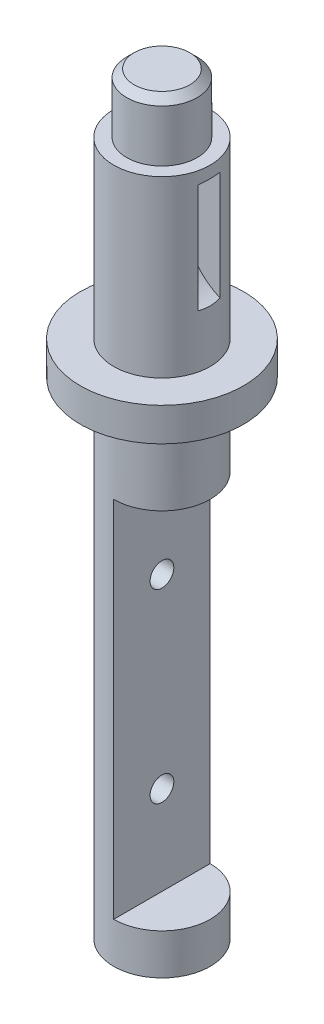
ISO-10303-21;
HEADER;
FILE_DESCRIPTION(('STEP AP214'),'2;1');
FILE_NAME('part.step','',(''),(''),'','','');
FILE_SCHEMA(('AUTOMOTIVE_DESIGN { 1 0 10303 214 1 1 1 1 }'));
ENDSEC;
DATA;
#1=APPLICATION_CONTEXT('core data for automotive mechanical design processes');
#2=APPLICATION_PROTOCOL_DEFINITION('international standard','automotive_design',2000,#1);
#3=PRODUCT_CONTEXT('',#1,'mechanical');
#4=PRODUCT('Part','Part','',(#3));
#5=PRODUCT_RELATED_PRODUCT_CATEGORY('part','',(#4));
#6=PRODUCT_DEFINITION_FORMATION('','',#4);
#7=PRODUCT_DEFINITION_CONTEXT('part definition',#1,'design');
#8=PRODUCT_DEFINITION('design','',#6,#7);
#9=PRODUCT_DEFINITION_SHAPE('','',#8);
#10=(LENGTH_UNIT() NAMED_UNIT(*) SI_UNIT(.MILLI.,.METRE.));
#11=(NAMED_UNIT(*) PLANE_ANGLE_UNIT() SI_UNIT($,.RADIAN.));
#12=(NAMED_UNIT(*) SI_UNIT($,.STERADIAN.) SOLID_ANGLE_UNIT());
#13=UNCERTAINTY_MEASURE_WITH_UNIT(LENGTH_MEASURE(1.E-05),#10,'distance_accuracy_value','');
#14=(GEOMETRIC_REPRESENTATION_CONTEXT(3) GLOBAL_UNCERTAINTY_ASSIGNED_CONTEXT((#13)) GLOBAL_UNIT_ASSIGNED_CONTEXT((#10,
#11,#12)) REPRESENTATION_CONTEXT('',''));
#15=CARTESIAN_POINT('',(0.,0.,0.));
#16=DIRECTION('',(0.,0.,1.));
#17=DIRECTION('',(1.,0.,0.));
#18=AXIS2_PLACEMENT_3D('',#15,#16,#17);
#19=CARTESIAN_POINT('',(0.,101.5,0.));
#20=DIRECTION('',(0.,1.,0.));
#21=DIRECTION('',(-1.,0.,0.));
#22=AXIS2_PLACEMENT_3D('',#19,#20,#21);
#23=CYLINDRICAL_SURFACE('',#22,6.5);
#24=CARTESIAN_POINT('',(0.,70.,0.));
#25=DIRECTION('',(0.,1.,0.));
#26=DIRECTION('',(-1.,0.,0.));
#27=AXIS2_PLACEMENT_3D('',#24,#25,#26);
#28=CIRCLE('',#27,6.5);
#29=CARTESIAN_POINT('',(-6.5,70.,0.));
#30=VERTEX_POINT('',#29);
#31=EDGE_CURVE('E164',#30,#30,#28,.T.);
#32=ORIENTED_EDGE('',*,*,#31,.T.);
#33=EDGE_LOOP('',(#32));
#34=FACE_BOUND('',#33,.T.);
#35=CARTESIAN_POINT('',(0.,93.5,0.));
#36=DIRECTION('',(0.,1.,0.));
#37=DIRECTION('',(-1.,0.,0.));
#38=AXIS2_PLACEMENT_3D('',#35,#36,#37);
#39=CIRCLE('',#38,6.5);
#40=CARTESIAN_POINT('',(-6.5,93.5,0.));
#41=VERTEX_POINT('',#40);
#42=EDGE_CURVE('E167',#41,#41,#39,.T.);
#43=ORIENTED_EDGE('',*,*,#42,.F.);
#44=EDGE_LOOP('',(#43));
#45=FACE_BOUND('',#44,.T.);
#46=DIRECTION('',(0.,1.,0.));
#47=VECTOR('',#46,1.);
#48=CARTESIAN_POINT('',(6.32455532033676,101.5,-1.5));
#49=LINE('',#48,#47);
#50=CARTESIAN_POINT('',(6.32455532033676,77.1572109463503,-1.5));
#51=VERTEX_POINT('',#50);
#52=CARTESIAN_POINT('',(6.32455532033676,91.8427890536497,-1.5));
#53=VERTEX_POINT('',#52);
#54=EDGE_CURVE('E11',#51,#53,#49,.T.);
#55=ORIENTED_EDGE('',*,*,#54,.F.);
#56=CARTESIAN_POINT('',(6.32455532033676,77.1572109463503,-1.5));
#57=CARTESIAN_POINT('',(6.36369188460603,77.1403303029999,-1.33510222582263));
#58=CARTESIAN_POINT('',(6.39639587269136,77.1265157354398,-1.16837509462122));
#59=CARTESIAN_POINT('',(6.44870789663685,77.1046910664355,-0.832452010255987));
#60=CARTESIAN_POINT('',(6.46831209671936,77.0966826650493,-0.663255348789912));
#61=CARTESIAN_POINT('',(6.49390271903072,77.0862612176093,-0.327198306937037));
#62=CARTESIAN_POINT('',(6.50016282821957,77.083735697357,-0.160362137256159));
#63=CARTESIAN_POINT('',(6.49983080920877,77.0838699020486,0.173224201777556));
#64=CARTESIAN_POINT('',(6.4932442174338,77.0865273933176,0.339974377212649));
#65=CARTESIAN_POINT('',(6.46723909581566,77.0971222306045,0.672879243442487));
#66=CARTESIAN_POINT('',(6.44777673660587,77.105077611357,0.839029944427268));
#67=CARTESIAN_POINT('',(6.39593146158079,77.1267109913205,1.17073737982097));
#68=CARTESIAN_POINT('',(6.36341374617465,77.1404487690674,1.33626914011728));
#69=CARTESIAN_POINT('',(6.32455532033676,77.1572109463503,1.5));
#70=B_SPLINE_CURVE_WITH_KNOTS('',3,(#56,#57,#58,#59,#60,#61,#62,#63,#64,#65,#66,#67,#68,#69),
.UNSPECIFIED.,.F.,.F.,(4,2,2,2,2,2,4),(0.,0.510779497228711,1.02170849145992,1.52205330932766,
2.02218254583026,2.5240230526441,3.03118421156089),.UNSPECIFIED.);
#71=CARTESIAN_POINT('',(6.32455532033676,77.1572109463503,1.5));
#72=VERTEX_POINT('',#71);
#73=EDGE_CURVE('E51',#51,#72,#70,.T.);
#74=ORIENTED_EDGE('',*,*,#73,.T.);
#75=DIRECTION('',(0.,1.,0.));
#76=VECTOR('',#75,1.);
#77=CARTESIAN_POINT('',(6.32455532033676,101.5,1.5));
#78=LINE('',#77,#76);
#79=CARTESIAN_POINT('',(6.32455532033676,91.8427890536497,1.5));
#80=VERTEX_POINT('',#79);
#81=EDGE_CURVE('E82',#72,#80,#78,.T.);
#82=ORIENTED_EDGE('',*,*,#81,.T.);
#83=CARTESIAN_POINT('',(6.32455532033676,91.8427890536497,1.5));
#84=CARTESIAN_POINT('',(6.36369188460603,91.8596696970001,1.33510222582263));
#85=CARTESIAN_POINT('',(6.39639587269136,91.8734842645602,1.16837509462122));
#86=CARTESIAN_POINT('',(6.44870789663685,91.8953089335645,0.832452010255986));
#87=CARTESIAN_POINT('',(6.46831209671936,91.9033173349507,0.663255348789912));
#88=CARTESIAN_POINT('',(6.49390271903072,91.9137387823907,0.327198306937037));
#89=CARTESIAN_POINT('',(6.50016282821957,91.916264302643,0.160362137256159));
#90=CARTESIAN_POINT('',(6.49983080920877,91.9161300979514,-0.173224201777556));
#91=CARTESIAN_POINT('',(6.4932442174338,91.9134726066824,-0.339974377212648));
#92=CARTESIAN_POINT('',(6.46723909581566,91.9028777693955,-0.672879243442486));
#93=CARTESIAN_POINT('',(6.44777673660587,91.894922388643,-0.839029944427268));
#94=CARTESIAN_POINT('',(6.39593146158079,91.8732890086795,-1.17073737982097));
#95=CARTESIAN_POINT('',(6.36341374617465,91.8595512309326,-1.33626914011728));
#96=CARTESIAN_POINT('',(6.32455532033676,91.8427890536497,-1.5));
#97=B_SPLINE_CURVE_WITH_KNOTS('',3,(#83,#84,#85,#86,#87,#88,#89,#90,#91,#92,#93,#94,#95,#96),
.UNSPECIFIED.,.F.,.F.,(4,2,2,2,2,2,4),(0.,0.510779497228712,1.02170849145992,1.52205330932765,
2.02218254583026,2.5240230526441,3.03118421156089),.UNSPECIFIED.);
#98=EDGE_CURVE('E88',#80,#53,#97,.T.);
#99=ORIENTED_EDGE('',*,*,#98,.T.);
#100=EDGE_LOOP('',(#55,#74,#82,#99));
#101=FACE_BOUND('',#100,.T.);
#102=ADVANCED_FACE('F41',(#34,#45,#101),#23,.T.);
#103=CARTESIAN_POINT('',(0.,0.,0.));
#104=DIRECTION('',(0.,1.,0.));
#105=DIRECTION('',(-1.,0.,0.));
#106=AXIS2_PLACEMENT_3D('',#103,#104,#105);
#107=PLANE('',#106);
#108=CARTESIAN_POINT('',(0.,0.,0.));
#109=DIRECTION('',(0.,1.,0.));
#110=DIRECTION('',(-1.,0.,0.));
#111=AXIS2_PLACEMENT_3D('',#108,#109,#110);
#112=CIRCLE('',#111,6.5);
#113=CARTESIAN_POINT('',(-6.5,0.,0.));
#114=VERTEX_POINT('',#113);
#115=EDGE_CURVE('E191',#114,#114,#112,.T.);
#116=ORIENTED_EDGE('',*,*,#115,.F.);
#117=EDGE_LOOP('',(#116));
#118=FACE_BOUND('',#117,.T.);
#119=ADVANCED_FACE('F154',(#118),#107,.F.);
#120=CARTESIAN_POINT('',(0.,101.5,0.));
#121=DIRECTION('',(0.,1.,0.));
#122=DIRECTION('',(-1.,0.,0.));
#123=AXIS2_PLACEMENT_3D('',#120,#121,#122);
#124=CYLINDRICAL_SURFACE('',#123,6.5);
#125=CARTESIAN_POINT('',(-6.5,40.9,0.));
#126=CARTESIAN_POINT('',(-6.49999847679289,40.9000025600073,-0.0884450959741308));
#127=CARTESIAN_POINT('',(-6.49817676699475,40.907358311482,-0.176919069140547));
#128=CARTESIAN_POINT('',(-6.49108604637441,40.9365446642992,-0.351334263124421));
#129=CARTESIAN_POINT('',(-6.48581501588464,40.9583837461114,-0.437273969233678));
#130=CARTESIAN_POINT('',(-6.47240975585621,41.0157958286159,-0.604076483461091));
#131=CARTESIAN_POINT('',(-6.46427890852362,41.0513526106517,-0.684945156371071));
#132=CARTESIAN_POINT('',(-6.4460214474454,41.1351344107593,-0.839569428496132));
#133=CARTESIAN_POINT('',(-6.43589478136753,41.1833597610239,-0.913324841119285));
#134=CARTESIAN_POINT('',(-6.41451977935108,41.292129387444,-1.05310528239877));
#135=CARTESIAN_POINT('',(-6.4032545638188,41.352879368107,-1.11896767068979));
#136=CARTESIAN_POINT('',(-6.38098512142482,41.4845332172551,-1.23967933009471));
#137=CARTESIAN_POINT('',(-6.3699809232828,41.5554381971066,-1.29452739421706));
#138=CARTESIAN_POINT('',(-6.34930979320854,41.7066443241118,-1.3924122072462));
#139=CARTESIAN_POINT('',(-6.33966431781124,41.7870657086879,-1.43526816323326));
#140=CARTESIAN_POINT('',(-6.32304842116449,41.9542469193137,-1.50678997701349));
#141=CARTESIAN_POINT('',(-6.31607758659514,42.0410057635491,-1.5354580275028));
#142=CARTESIAN_POINT('',(-6.30577353146237,42.2166137380089,-1.57723764537635));
#143=CARTESIAN_POINT('',(-6.30237216358611,42.3053893378179,-1.59064108188605));
#144=CARTESIAN_POINT('',(-6.29938808755674,42.4839892271366,-1.60241992785259));
#145=CARTESIAN_POINT('',(-6.29980477827164,42.5738133493383,-1.60079770301542));
#146=CARTESIAN_POINT('',(-6.30434842318276,42.7497324726038,-1.58280440383047));
#147=CARTESIAN_POINT('',(-6.30838817205864,42.8358655308682,-1.56677996482469));
#148=CARTESIAN_POINT('',(-6.31958392378279,43.0041816336552,-1.52098957994436));
#149=CARTESIAN_POINT('',(-6.32674014258101,43.0863644040117,-1.49122268180325));
#150=CARTESIAN_POINT('',(-6.34344330774301,43.2453823552798,-1.41849402659643));
#151=CARTESIAN_POINT('',(-6.35301305186749,43.3221570640332,-1.37540550538329));
#152=CARTESIAN_POINT('',(-6.37345198810655,43.4675111773534,-1.27734544159618));
#153=CARTESIAN_POINT('',(-6.38432140105722,43.53608918519,-1.22237187826304));
#154=CARTESIAN_POINT('',(-6.40650306081737,43.6650909076582,-1.10030157431611));
#155=CARTESIAN_POINT('',(-6.4178192482921,43.725237197386,-1.0329120144452));
#156=CARTESIAN_POINT('',(-6.43934844063598,43.8334267078951,-0.888868155037166));
#157=CARTESIAN_POINT('',(-6.44956141379675,43.8814695808553,-0.812213589341127));
#158=CARTESIAN_POINT('',(-6.46778178886516,43.9641859630261,-0.651427281318158));
#159=CARTESIAN_POINT('',(-6.475781919824,43.9988155446562,-0.567272063289674));
#160=CARTESIAN_POINT('',(-6.48862222528603,44.0533598817869,-0.394094239193905));
#161=CARTESIAN_POINT('',(-6.4934629852469,44.0732773636519,-0.305072538241802));
#162=CARTESIAN_POINT('',(-6.49935291484978,44.0974110610489,-0.127061671114192));
#163=CARTESIAN_POINT('',(-6.50049333179833,44.1020052180412,-0.038126688605644));
#164=CARTESIAN_POINT('',(-6.49911342661941,44.0963968632235,0.139241112863296));
#165=CARTESIAN_POINT('',(-6.49659342331214,44.0861956400816,0.227673974884574));
#166=CARTESIAN_POINT('',(-6.4882341917293,44.0515979133135,0.40022184155561));
#167=CARTESIAN_POINT('',(-6.48244296155053,44.0274065645594,0.484380517349514));
#168=CARTESIAN_POINT('',(-6.46819327022747,43.9657487614887,0.647441551075505));
#169=CARTESIAN_POINT('',(-6.45973454457628,43.9282809906462,0.72634338680296));
#170=CARTESIAN_POINT('',(-6.44086865877031,43.8403943888819,0.87816243308333));
#171=CARTESIAN_POINT('',(-6.43043029526398,43.7897625279667,0.950952352705239));
#172=CARTESIAN_POINT('',(-6.4088139161694,43.6772583307833,1.08713696901788));
#173=CARTESIAN_POINT('',(-6.39763577723942,43.6153841170762,1.15053009325664));
#174=CARTESIAN_POINT('',(-6.37547290612023,43.4803991357933,1.26767107080319));
#175=CARTESIAN_POINT('',(-6.3644990662902,43.407056472249,1.32115419992861));
#176=CARTESIAN_POINT('',(-6.34428432556465,43.252213034813,1.41505206113258));
#177=CARTESIAN_POINT('',(-6.33504334732852,43.1707126252649,1.45546737650864));
#178=CARTESIAN_POINT('',(-6.31944109818521,43.0023078147583,1.52178359815182));
#179=CARTESIAN_POINT('',(-6.31306281407692,42.9154389277139,1.54777047861512));
#180=CARTESIAN_POINT('',(-6.30388950053647,42.7383849624583,1.58472282899883));
#181=CARTESIAN_POINT('',(-6.30109371588561,42.6482005873027,1.59569146491517));
#182=CARTESIAN_POINT('',(-6.2994582563016,42.469766053111,1.60213437636161));
#183=CARTESIAN_POINT('',(-6.30051067071695,42.3815318951603,1.59803127643297));
#184=CARTESIAN_POINT('',(-6.30620423919642,42.207054938739,1.57541152386757));
#185=CARTESIAN_POINT('',(-6.31084532535473,42.1208121026199,1.55689514396265));
#186=CARTESIAN_POINT('',(-6.32313410038235,41.9532093638998,1.50620197689929));
#187=CARTESIAN_POINT('',(-6.33076482963178,41.8718248507785,1.47410216486609));
#188=CARTESIAN_POINT('',(-6.34817596823125,41.7155394032788,1.39721464976362));
#189=CARTESIAN_POINT('',(-6.35795666659036,41.6406393424599,1.35242524066421));
#190=CARTESIAN_POINT('',(-6.37887533010823,41.4974012527481,1.25009507865889));
#191=CARTESIAN_POINT('',(-6.39004140338445,41.4292775439332,1.19226002366241));
#192=CARTESIAN_POINT('',(-6.41230232297716,41.303564567394,1.06605685145264));
#193=CARTESIAN_POINT('',(-6.42339715183421,41.2459777934556,0.997686247816543));
#194=CARTESIAN_POINT('',(-6.44449584945342,41.141997840714,0.850916228091247));
#195=CARTESIAN_POINT('',(-6.45447736265697,41.0958169885822,0.772362939181988));
#196=CARTESIAN_POINT('',(-6.47199065299952,41.0173897495588,0.608370445134174));
#197=CARTESIAN_POINT('',(-6.47952422432342,40.9851331513573,0.522936340766141));
#198=CARTESIAN_POINT('',(-6.49014861566423,40.9403850199706,0.36468429109301));
#199=CARTESIAN_POINT('',(-6.49381784225452,40.9252728525866,0.292634834729842));
#200=CARTESIAN_POINT('',(-6.49874408258204,40.9050796322138,0.147063504485682));
#201=CARTESIAN_POINT('',(-6.50000126654047,40.8999978713644,0.0735417348779227));
#202=CARTESIAN_POINT('',(-6.5,40.9,0.));
#203=B_SPLINE_CURVE_WITH_KNOTS('',3,(#125,#126,#127,#128,#129,#130,#131,#132,#133,#134,#135,
#136,#137,#138,#139,#140,#141,#142,#143,#144,#145,#146,#147,#148,#149,#150,#151,#152,#153,#154,
#155,#156,#157,#158,#159,#160,#161,#162,#163,#164,#165,#166,#167,#168,#169,#170,#171,#172,#173,
#174,#175,#176,#177,#178,#179,#180,#181,#182,#183,#184,#185,#186,#187,#188,#189,#190,#191,#192,
#193,#194,#195,#196,#197,#198,#199,#200,#201,#202),.UNSPECIFIED.,.T.,.F.,(4,2,2,2,2,2,2,2,2,2,2,
2,2,2,2,2,2,2,2,2,2,2,2,2,2,2,2,2,2,2,2,2,2,2,2,2,2,2,4),(0.,0.265065826097963,
0.530286994213678,0.795195543358522,1.06011103957947,1.32978472451693,1.59948794521558,
1.87306152995696,2.14659282154836,2.41480126402156,2.68296747929984,2.944847317652,
3.20674530536507,3.47121640084301,3.73573249854129,4.00755204127506,4.27937939451653,
4.55208958456014,4.82474922478114,5.09063207777168,5.35649177392924,5.61854827597385,
5.88063077152499,6.14725157568416,6.41391694570262,6.68691332818938,6.95989752347348,
7.23123714500753,7.50251955662789,7.76625378635416,8.02998302575402,8.29223735599092,
8.55452696128593,8.82346155925037,9.09245972411299,9.36614096691334,9.63962116401274,
9.86003786792978,10.0804390161607),.UNSPECIFIED.);
#204=CARTESIAN_POINT('',(-6.5,40.9,0.));
#205=VERTEX_POINT('',#204);
#206=EDGE_CURVE('E97',#205,#205,#203,.T.);
#207=ORIENTED_EDGE('',*,*,#206,.T.);
#208=EDGE_LOOP('',(#207));
#209=FACE_BOUND('',#208,.T.);
#210=CARTESIAN_POINT('',(-6.5,15.9,0.));
#211=CARTESIAN_POINT('',(-6.49999847679289,15.9000025600073,-0.088445095974131));
#212=CARTESIAN_POINT('',(-6.49817676699475,15.907358311482,-0.176919069140547));
#213=CARTESIAN_POINT('',(-6.49108604637441,15.9365446642992,-0.351334263124422));
#214=CARTESIAN_POINT('',(-6.48581501588464,15.9583837461114,-0.437273969233679));
#215=CARTESIAN_POINT('',(-6.4724097558562,16.0157958286159,-0.604076483461092));
#216=CARTESIAN_POINT('',(-6.46427890852362,16.0513526106517,-0.684945156371072));
#217=CARTESIAN_POINT('',(-6.4460214474454,16.1351344107593,-0.839569428496132));
#218=CARTESIAN_POINT('',(-6.43589478136753,16.1833597610239,-0.913324841119284));
#219=CARTESIAN_POINT('',(-6.41451977935108,16.292129387444,-1.05310528239877));
#220=CARTESIAN_POINT('',(-6.4032545638188,16.352879368107,-1.1189676706898));
#221=CARTESIAN_POINT('',(-6.38098512142482,16.4845332172551,-1.23967933009471));
#222=CARTESIAN_POINT('',(-6.36998092328279,16.5554381971066,-1.29452739421707));
#223=CARTESIAN_POINT('',(-6.34930979320853,16.7066443241118,-1.3924122072462));
#224=CARTESIAN_POINT('',(-6.33966431781124,16.7870657086879,-1.43526816323327));
#225=CARTESIAN_POINT('',(-6.32304842116448,16.9542469193137,-1.5067899770135));
#226=CARTESIAN_POINT('',(-6.31607758659514,17.0410057635491,-1.53545802750281));
#227=CARTESIAN_POINT('',(-6.30577353146237,17.2166137380089,-1.57723764537635));
#228=CARTESIAN_POINT('',(-6.30237216358611,17.3053893378179,-1.59064108188605));
#229=CARTESIAN_POINT('',(-6.29938808755674,17.4839892271366,-1.60241992785259));
#230=CARTESIAN_POINT('',(-6.29980477827164,17.5738133493383,-1.60079770301542));
#231=CARTESIAN_POINT('',(-6.30434842318276,17.7497324726038,-1.58280440383047));
#232=CARTESIAN_POINT('',(-6.30838817205863,17.8358655308682,-1.56677996482469));
#233=CARTESIAN_POINT('',(-6.31958392378279,18.0041816336552,-1.52098957994436));
#234=CARTESIAN_POINT('',(-6.32674014258101,18.0863644040117,-1.49122268180326));
#235=CARTESIAN_POINT('',(-6.34344330774301,18.2453823552798,-1.41849402659644));
#236=CARTESIAN_POINT('',(-6.35301305186749,18.3221570640332,-1.37540550538329));
#237=CARTESIAN_POINT('',(-6.37345198810655,18.4675111773534,-1.27734544159618));
#238=CARTESIAN_POINT('',(-6.38432140105722,18.53608918519,-1.22237187826304));
#239=CARTESIAN_POINT('',(-6.40650306081737,18.6650909076582,-1.10030157431611));
#240=CARTESIAN_POINT('',(-6.4178192482921,18.725237197386,-1.0329120144452));
#241=CARTESIAN_POINT('',(-6.43934844063598,18.8334267078951,-0.888868155037164));
#242=CARTESIAN_POINT('',(-6.44956141379675,18.8814695808552,-0.812213589341126));
#243=CARTESIAN_POINT('',(-6.46778178886515,18.9641859630261,-0.651427281318159));
#244=CARTESIAN_POINT('',(-6.475781919824,18.9988155446562,-0.567272063289675));
#245=CARTESIAN_POINT('',(-6.48862222528603,19.0533598817869,-0.394094239193908));
#246=CARTESIAN_POINT('',(-6.4934629852469,19.0732773636519,-0.305072538241805));
#247=CARTESIAN_POINT('',(-6.49935291484978,19.0974110610489,-0.127061671114194));
#248=CARTESIAN_POINT('',(-6.50049333179833,19.1020052180412,-0.0381266886056464));
#249=CARTESIAN_POINT('',(-6.49911342661941,19.0963968632235,0.139241112863294));
#250=CARTESIAN_POINT('',(-6.49659342331214,19.0861956400816,0.227673974884573));
#251=CARTESIAN_POINT('',(-6.4882341917293,19.0515979133135,0.400221841555611));
#252=CARTESIAN_POINT('',(-6.48244296155053,19.0274065645594,0.484380517349516));
#253=CARTESIAN_POINT('',(-6.46819327022747,18.9657487614887,0.647441551075507));
#254=CARTESIAN_POINT('',(-6.45973454457628,18.9282809906462,0.726343386802961));
#255=CARTESIAN_POINT('',(-6.44086865877031,18.8403943888819,0.878162433083331));
#256=CARTESIAN_POINT('',(-6.43043029526397,18.7897625279667,0.950952352705241));
#257=CARTESIAN_POINT('',(-6.4088139161694,18.6772583307833,1.08713696901789));
#258=CARTESIAN_POINT('',(-6.39763577723942,18.6153841170762,1.15053009325664));
#259=CARTESIAN_POINT('',(-6.37547290612023,18.4803991357933,1.26767107080319));
#260=CARTESIAN_POINT('',(-6.36449906629019,18.407056472249,1.32115419992861));
#261=CARTESIAN_POINT('',(-6.34428432556464,18.252213034813,1.41505206113259));
#262=CARTESIAN_POINT('',(-6.33504334732852,18.1707126252649,1.45546737650864));
#263=CARTESIAN_POINT('',(-6.31944109818521,18.0023078147583,1.52178359815182));
#264=CARTESIAN_POINT('',(-6.31306281407692,17.9154389277139,1.54777047861512));
#265=CARTESIAN_POINT('',(-6.30388950053647,17.7383849624583,1.58472282899883));
#266=CARTESIAN_POINT('',(-6.30109371588561,17.6482005873027,1.59569146491517));
#267=CARTESIAN_POINT('',(-6.2994582563016,17.4697660531109,1.60213437636162));
#268=CARTESIAN_POINT('',(-6.30051067071695,17.3815318951603,1.59803127643297));
#269=CARTESIAN_POINT('',(-6.30620423919642,17.207054938739,1.57541152386757));
#270=CARTESIAN_POINT('',(-6.31084532535473,17.1208121026199,1.55689514396265));
#271=CARTESIAN_POINT('',(-6.32313410038234,16.9532093638998,1.50620197689929));
#272=CARTESIAN_POINT('',(-6.33076482963178,16.8718248507785,1.47410216486609));
#273=CARTESIAN_POINT('',(-6.34817596823125,16.7155394032788,1.39721464976361));
#274=CARTESIAN_POINT('',(-6.35795666659036,16.6406393424599,1.35242524066421));
#275=CARTESIAN_POINT('',(-6.37887533010823,16.4974012527481,1.25009507865889));
#276=CARTESIAN_POINT('',(-6.39004140338445,16.4292775439332,1.1922600236624));
#277=CARTESIAN_POINT('',(-6.41230232297716,16.303564567394,1.06605685145264));
#278=CARTESIAN_POINT('',(-6.42339715183421,16.2459777934556,0.997686247816544));
#279=CARTESIAN_POINT('',(-6.44449584945342,16.141997840714,0.850916228091249));
#280=CARTESIAN_POINT('',(-6.45447736265697,16.0958169885822,0.77236293918199));
#281=CARTESIAN_POINT('',(-6.47199065299951,16.0173897495588,0.608370445134174));
#282=CARTESIAN_POINT('',(-6.47952422432342,15.9851331513573,0.522936340766138));
#283=CARTESIAN_POINT('',(-6.49014861566423,15.9403850199706,0.364684291093005));
#284=CARTESIAN_POINT('',(-6.49381784225452,15.9252728525866,0.292634834729838));
#285=CARTESIAN_POINT('',(-6.49874408258204,15.9050796322138,0.147063504485679));
#286=CARTESIAN_POINT('',(-6.50000126654047,15.8999978713644,0.073541734877921));
#287=CARTESIAN_POINT('',(-6.5,15.9,0.));
#288=B_SPLINE_CURVE_WITH_KNOTS('',3,(#210,#211,#212,#213,#214,#215,#216,#217,#218,#219,#220,
#221,#222,#223,#224,#225,#226,#227,#228,#229,#230,#231,#232,#233,#234,#235,#236,#237,#238,#239,
#240,#241,#242,#243,#244,#245,#246,#247,#248,#249,#250,#251,#252,#253,#254,#255,#256,#257,#258,
#259,#260,#261,#262,#263,#264,#265,#266,#267,#268,#269,#270,#271,#272,#273,#274,#275,#276,#277,
#278,#279,#280,#281,#282,#283,#284,#285,#286,#287),.UNSPECIFIED.,.T.,.F.,(4,2,2,2,2,2,2,2,2,2,2,
2,2,2,2,2,2,2,2,2,2,2,2,2,2,2,2,2,2,2,2,2,2,2,2,2,2,2,4),(0.,0.265065826097963,0.53028699421368,
0.795195543358523,1.06011103957947,1.32978472451694,1.59948794521559,1.87306152995697,
2.14659282154836,2.41480126402155,2.68296747929983,2.944847317652,3.20674530536507,
3.47121640084301,3.73573249854129,4.00755204127507,4.27937939451653,4.55208958456014,
4.82474922478114,5.09063207777168,5.35649177392925,5.61854827597386,5.88063077152499,
6.14725157568417,6.41391694570263,6.68691332818939,6.95989752347349,7.23123714500754,
7.5025195566279,7.76625378635418,8.02998302575403,8.29223735599093,8.55452696128594,
8.82346155925038,9.092459724113,9.36614096691335,9.63962116401275,9.86003786792979,
10.0804390161607),.UNSPECIFIED.);
#289=CARTESIAN_POINT('',(-6.5,15.9,0.));
#290=VERTEX_POINT('',#289);
#291=EDGE_CURVE('E236',#290,#290,#288,.T.);
#292=ORIENTED_EDGE('',*,*,#291,.T.);
#293=EDGE_LOOP('',(#292));
#294=FACE_BOUND('',#293,.T.);
#295=DIRECTION('',(0.,1.,0.));
#296=VECTOR('',#295,1.);
#297=CARTESIAN_POINT('',(0.,101.5,6.5));
#298=LINE('',#297,#296);
#299=CARTESIAN_POINT('',(0.,5.50000000000001,6.5));
#300=VERTEX_POINT('',#299);
#301=CARTESIAN_POINT('',(0.,54.5,6.5));
#302=VERTEX_POINT('',#301);
#303=EDGE_CURVE('E211',#300,#302,#298,.T.);
#304=ORIENTED_EDGE('',*,*,#303,.T.);
#305=CARTESIAN_POINT('',(0.,54.5,0.));
#306=DIRECTION('',(0.,1.,0.));
#307=DIRECTION('',(0.,0.,1.));
#308=AXIS2_PLACEMENT_3D('',#305,#306,#307);
#309=CIRCLE('',#308,6.5);
#310=CARTESIAN_POINT('',(0.,54.5,-6.5));
#311=VERTEX_POINT('',#310);
#312=EDGE_CURVE('E89',#302,#311,#309,.T.);
#313=ORIENTED_EDGE('',*,*,#312,.T.);
#314=DIRECTION('',(0.,1.,0.));
#315=VECTOR('',#314,1.);
#316=CARTESIAN_POINT('',(0.,101.5,-6.5));
#317=LINE('',#316,#315);
#318=CARTESIAN_POINT('',(0.,5.50000000000001,-6.5));
#319=VERTEX_POINT('',#318);
#320=EDGE_CURVE('E207',#311,#319,#317,.F.);
#321=ORIENTED_EDGE('',*,*,#320,.T.);
#322=CARTESIAN_POINT('',(0.,5.50000000000001,0.));
#323=DIRECTION('',(0.,-1.,0.));
#324=DIRECTION('',(1.,0.,0.));
#325=AXIS2_PLACEMENT_3D('',#322,#323,#324);
#326=CIRCLE('',#325,6.5);
#327=EDGE_CURVE('E203',#319,#300,#326,.T.);
#328=ORIENTED_EDGE('',*,*,#327,.T.);
#329=EDGE_LOOP('',(#304,#313,#321,#328));
#330=FACE_BOUND('',#329,.T.);
#331=CARTESIAN_POINT('',(0.,65.5,0.));
#332=DIRECTION('',(0.,1.,0.));
#333=DIRECTION('',(-1.,0.,0.));
#334=AXIS2_PLACEMENT_3D('',#331,#332,#333);
#335=CIRCLE('',#334,6.5);
#336=CARTESIAN_POINT('',(-6.5,65.5,0.));
#337=VERTEX_POINT('',#336);
#338=EDGE_CURVE('E187',#337,#337,#335,.T.);
#339=ORIENTED_EDGE('',*,*,#338,.F.);
#340=EDGE_LOOP('',(#339));
#341=FACE_BOUND('',#340,.T.);
#342=ORIENTED_EDGE('',*,*,#115,.T.);
#343=EDGE_LOOP('',(#342));
#344=FACE_BOUND('',#343,.T.);
#345=ADVANCED_FACE('F159',(#209,#294,#330,#341,#344),#124,.T.);
#346=CARTESIAN_POINT('',(6.5,65.5,0.));
#347=DIRECTION('',(0.,1.,0.));
#348=DIRECTION('',(-1.,0.,0.));
#349=AXIS2_PLACEMENT_3D('',#346,#347,#348);
#350=PLANE('',#349);
#351=CARTESIAN_POINT('',(0.,65.5,0.));
#352=DIRECTION('',(0.,1.,0.));
#353=DIRECTION('',(-1.,0.,0.));
#354=AXIS2_PLACEMENT_3D('',#351,#352,#353);
#355=CIRCLE('',#354,11.);
#356=CARTESIAN_POINT('',(-11.,65.5,0.));
#357=VERTEX_POINT('',#356);
#358=EDGE_CURVE('E183',#357,#357,#355,.T.);
#359=ORIENTED_EDGE('',*,*,#358,.F.);
#360=EDGE_LOOP('',(#359));
#361=FACE_BOUND('',#360,.T.);
#362=ORIENTED_EDGE('',*,*,#338,.T.);
#363=EDGE_LOOP('',(#362));
#364=FACE_BOUND('',#363,.T.);
#365=ADVANCED_FACE('F335',(#361,#364),#350,.F.);
#366=CARTESIAN_POINT('',(0.,101.5,0.));
#367=DIRECTION('',(0.,1.,0.));
#368=DIRECTION('',(-1.,0.,0.));
#369=AXIS2_PLACEMENT_3D('',#366,#367,#368);
#370=CYLINDRICAL_SURFACE('',#369,11.);
#371=CARTESIAN_POINT('',(0.,70.,0.));
#372=DIRECTION('',(0.,1.,0.));
#373=DIRECTION('',(-1.,0.,0.));
#374=AXIS2_PLACEMENT_3D('',#371,#372,#373);
#375=CIRCLE('',#374,11.);
#376=CARTESIAN_POINT('',(-11.,70.,0.));
#377=VERTEX_POINT('',#376);
#378=EDGE_CURVE('E173',#377,#377,#375,.T.);
#379=ORIENTED_EDGE('',*,*,#378,.F.);
#380=EDGE_LOOP('',(#379));
#381=FACE_BOUND('',#380,.T.);
#382=ORIENTED_EDGE('',*,*,#358,.T.);
#383=EDGE_LOOP('',(#382));
#384=FACE_BOUND('',#383,.T.);
#385=ADVANCED_FACE('F149',(#381,#384),#370,.T.);
#386=CARTESIAN_POINT('',(11.,70.,0.));
#387=DIRECTION('',(0.,-1.,0.));
#388=DIRECTION('',(1.,0.,0.));
#389=AXIS2_PLACEMENT_3D('',#386,#387,#388);
#390=PLANE('',#389);
#391=ORIENTED_EDGE('',*,*,#31,.F.);
#392=EDGE_LOOP('',(#391));
#393=FACE_BOUND('',#392,.T.);
#394=ORIENTED_EDGE('',*,*,#378,.T.);
#395=EDGE_LOOP('',(#394));
#396=FACE_BOUND('',#395,.T.);
#397=ADVANCED_FACE('F144',(#393,#396),#390,.F.);
#398=CARTESIAN_POINT('',(6.5,93.5,0.));
#399=DIRECTION('',(0.,-1.,0.));
#400=DIRECTION('',(1.,0.,0.));
#401=AXIS2_PLACEMENT_3D('',#398,#399,#400);
#402=PLANE('',#401);
#403=CARTESIAN_POINT('',(0.,93.5,0.));
#404=DIRECTION('',(0.,1.,0.));
#405=DIRECTION('',(-1.,0.,0.));
#406=AXIS2_PLACEMENT_3D('',#403,#404,#405);
#407=CIRCLE('',#406,4.75);
#408=CARTESIAN_POINT('',(-4.75000000000001,93.5,0.));
#409=VERTEX_POINT('',#408);
#410=EDGE_CURVE('E169',#409,#409,#407,.T.);
#411=ORIENTED_EDGE('',*,*,#410,.F.);
#412=EDGE_LOOP('',(#411));
#413=FACE_BOUND('',#412,.T.);
#414=ORIENTED_EDGE('',*,*,#42,.T.);
#415=EDGE_LOOP('',(#414));
#416=FACE_BOUND('',#415,.T.);
#417=ADVANCED_FACE('F141',(#413,#416),#402,.F.);
#418=CARTESIAN_POINT('',(0.,101.5,0.));
#419=DIRECTION('',(0.,1.,0.));
#420=DIRECTION('',(-1.,0.,0.));
#421=AXIS2_PLACEMENT_3D('',#418,#419,#420);
#422=CYLINDRICAL_SURFACE('',#421,4.75);
#423=CARTESIAN_POINT('',(0.,100.5,0.));
#424=DIRECTION('',(0.,-1.,0.));
#425=DIRECTION('',(1.,0.,0.));
#426=AXIS2_PLACEMENT_3D('',#423,#424,#425);
#427=CIRCLE('',#426,4.75);
#428=CARTESIAN_POINT('',(4.75,100.5,0.));
#429=VERTEX_POINT('',#428);
#430=EDGE_CURVE('E199',#429,#429,#427,.T.);
#431=ORIENTED_EDGE('',*,*,#430,.T.);
#432=EDGE_LOOP('',(#431));
#433=FACE_BOUND('',#432,.T.);
#434=ORIENTED_EDGE('',*,*,#410,.T.);
#435=EDGE_LOOP('',(#434));
#436=FACE_BOUND('',#435,.T.);
#437=ADVANCED_FACE('F138',(#433,#436),#422,.T.);
#438=CARTESIAN_POINT('',(4.75,101.5,0.));
#439=DIRECTION('',(0.,-1.,0.));
#440=DIRECTION('',(1.,0.,0.));
#441=AXIS2_PLACEMENT_3D('',#438,#439,#440);
#442=PLANE('',#441);
#443=CARTESIAN_POINT('',(0.,101.5,0.));
#444=DIRECTION('',(0.,-1.,0.));
#445=DIRECTION('',(1.,0.,0.));
#446=AXIS2_PLACEMENT_3D('',#443,#444,#445);
#447=CIRCLE('',#446,3.75);
#448=CARTESIAN_POINT('',(3.75,101.5,0.));
#449=VERTEX_POINT('',#448);
#450=EDGE_CURVE('E195',#449,#449,#447,.F.);
#451=ORIENTED_EDGE('',*,*,#450,.T.);
#452=EDGE_LOOP('',(#451));
#453=FACE_BOUND('',#452,.T.);
#454=ADVANCED_FACE('F135',(#453),#442,.F.);
#455=CARTESIAN_POINT('',(0.,101.5,0.));
#456=DIRECTION('',(0.,-1.,0.));
#457=DIRECTION('',(1.,0.,0.));
#458=AXIS2_PLACEMENT_3D('',#455,#456,#457);
#459=CONICAL_SURFACE('',#458,3.75,0.785398163397447);
#460=ORIENTED_EDGE('',*,*,#430,.F.);
#461=EDGE_LOOP('',(#460));
#462=FACE_BOUND('',#461,.T.);
#463=ORIENTED_EDGE('',*,*,#450,.F.);
#464=EDGE_LOOP('',(#463));
#465=FACE_BOUND('',#464,.T.);
#466=ADVANCED_FACE('F43',(#462,#465),#459,.T.);
#467=CARTESIAN_POINT('',(0.,54.5,-11.));
#468=DIRECTION('',(-1.,0.,0.));
#469=DIRECTION('',(0.,-1.,0.));
#470=AXIS2_PLACEMENT_3D('',#467,#468,#469);
#471=PLANE('',#470);
#472=CARTESIAN_POINT('',(0.,42.5,0.));
#473=DIRECTION('',(-1.,0.,0.));
#474=DIRECTION('',(0.,-1.,0.));
#475=AXIS2_PLACEMENT_3D('',#472,#473,#474);
#476=CIRCLE('',#475,1.6);
#477=CARTESIAN_POINT('',(0.,40.9,0.));
#478=VERTEX_POINT('',#477);
#479=EDGE_CURVE('E45',#478,#478,#476,.T.);
#480=ORIENTED_EDGE('',*,*,#479,.T.);
#481=EDGE_LOOP('',(#480));
#482=FACE_BOUND('',#481,.T.);
#483=CARTESIAN_POINT('',(0.,17.5,0.));
#484=DIRECTION('',(-1.,0.,0.));
#485=DIRECTION('',(0.,-1.,0.));
#486=AXIS2_PLACEMENT_3D('',#483,#484,#485);
#487=CIRCLE('',#486,1.6);
#488=CARTESIAN_POINT('',(0.,15.9,0.));
#489=VERTEX_POINT('',#488);
#490=EDGE_CURVE('E367',#489,#489,#487,.T.);
#491=ORIENTED_EDGE('',*,*,#490,.T.);
#492=EDGE_LOOP('',(#491));
#493=FACE_BOUND('',#492,.T.);
#494=DIRECTION('',(0.,0.,1.));
#495=VECTOR('',#494,1.);
#496=CARTESIAN_POINT('',(0.,5.5,-11.));
#497=LINE('',#496,#495);
#498=EDGE_CURVE('E65',#319,#300,#497,.T.);
#499=ORIENTED_EDGE('',*,*,#498,.F.);
#500=ORIENTED_EDGE('',*,*,#320,.F.);
#501=DIRECTION('',(0.,0.,1.));
#502=VECTOR('',#501,1.);
#503=CARTESIAN_POINT('',(0.,54.5,-11.));
#504=LINE('',#503,#502);
#505=EDGE_CURVE('E176',#311,#302,#504,.T.);
#506=ORIENTED_EDGE('',*,*,#505,.T.);
#507=ORIENTED_EDGE('',*,*,#303,.F.);
#508=EDGE_LOOP('',(#499,#500,#506,#507));
#509=FACE_BOUND('',#508,.T.);
#510=ADVANCED_FACE('F128',(#482,#493,#509),#471,.F.);
#511=CARTESIAN_POINT('',(0.,54.5,-11.));
#512=DIRECTION('',(0.,1.,0.));
#513=DIRECTION('',(0.,0.,1.));
#514=AXIS2_PLACEMENT_3D('',#511,#512,#513);
#515=PLANE('',#514);
#516=ORIENTED_EDGE('',*,*,#505,.F.);
#517=ORIENTED_EDGE('',*,*,#312,.F.);
#518=EDGE_LOOP('',(#516,#517));
#519=FACE_BOUND('',#518,.T.);
#520=ADVANCED_FACE('F124',(#519),#515,.F.);
#521=CARTESIAN_POINT('',(0.,5.5,-11.));
#522=DIRECTION('',(0.,-1.,0.));
#523=DIRECTION('',(1.,0.,0.));
#524=AXIS2_PLACEMENT_3D('',#521,#522,#523);
#525=PLANE('',#524);
#526=ORIENTED_EDGE('',*,*,#498,.T.);
#527=ORIENTED_EDGE('',*,*,#327,.F.);
#528=EDGE_LOOP('',(#526,#527));
#529=FACE_BOUND('',#528,.T.);
#530=ADVANCED_FACE('F122',(#529),#525,.F.);
#531=CARTESIAN_POINT('',(9.5,84.5,-1.5));
#532=DIRECTION('',(0.,0.,1.));
#533=DIRECTION('',(1.,0.,0.));
#534=AXIS2_PLACEMENT_3D('',#531,#532,#533);
#535=CYLINDRICAL_SURFACE('',#534,8.);
#536=CARTESIAN_POINT('',(9.5,84.5,-1.5));
#537=DIRECTION('',(0.,0.,1.));
#538=DIRECTION('',(1.,0.,0.));
#539=AXIS2_PLACEMENT_3D('',#536,#537,#538);
#540=CIRCLE('',#539,8.);
#541=EDGE_CURVE('E96',#53,#51,#540,.T.);
#542=ORIENTED_EDGE('',*,*,#541,.F.);
#543=ORIENTED_EDGE('',*,*,#98,.F.);
#544=CARTESIAN_POINT('',(9.5,84.5,1.5));
#545=DIRECTION('',(0.,0.,1.));
#546=DIRECTION('',(1.,0.,0.));
#547=AXIS2_PLACEMENT_3D('',#544,#545,#546);
#548=CIRCLE('',#547,8.);
#549=EDGE_CURVE('E58',#80,#72,#548,.T.);
#550=ORIENTED_EDGE('',*,*,#549,.T.);
#551=ORIENTED_EDGE('',*,*,#73,.F.);
#552=EDGE_LOOP('',(#542,#543,#550,#551));
#553=FACE_BOUND('',#552,.T.);
#554=ADVANCED_FACE('F93',(#553),#535,.F.);
#555=CARTESIAN_POINT('',(9.5,84.5,-1.5));
#556=DIRECTION('',(0.,0.,1.));
#557=DIRECTION('',(1.,0.,0.));
#558=AXIS2_PLACEMENT_3D('',#555,#556,#557);
#559=PLANE('',#558);
#560=ORIENTED_EDGE('',*,*,#54,.T.);
#561=ORIENTED_EDGE('',*,*,#541,.T.);
#562=EDGE_LOOP('',(#560,#561));
#563=FACE_BOUND('',#562,.T.);
#564=ADVANCED_FACE('F121',(#563),#559,.T.);
#565=CARTESIAN_POINT('',(9.5,84.5,1.5));
#566=DIRECTION('',(0.,0.,1.));
#567=DIRECTION('',(1.,0.,0.));
#568=AXIS2_PLACEMENT_3D('',#565,#566,#567);
#569=PLANE('',#568);
#570=ORIENTED_EDGE('',*,*,#549,.F.);
#571=ORIENTED_EDGE('',*,*,#81,.F.);
#572=EDGE_LOOP('',(#570,#571));
#573=FACE_BOUND('',#572,.T.);
#574=ADVANCED_FACE('F83',(#573),#569,.F.);
#575=CARTESIAN_POINT('',(-11.,17.5,0.));
#576=DIRECTION('',(1.,0.,0.));
#577=DIRECTION('',(0.,1.,0.));
#578=AXIS2_PLACEMENT_3D('',#575,#576,#577);
#579=CYLINDRICAL_SURFACE('',#578,1.6);
#580=ORIENTED_EDGE('',*,*,#490,.F.);
#581=EDGE_LOOP('',(#580));
#582=FACE_BOUND('',#581,.T.);
#583=ORIENTED_EDGE('',*,*,#291,.F.);
#584=EDGE_LOOP('',(#583));
#585=FACE_BOUND('',#584,.T.);
#586=ADVANCED_FACE('F246',(#582,#585),#579,.F.);
#587=CARTESIAN_POINT('',(-11.,42.5,0.));
#588=DIRECTION('',(1.,0.,0.));
#589=DIRECTION('',(0.,1.,0.));
#590=AXIS2_PLACEMENT_3D('',#587,#588,#589);
#591=CYLINDRICAL_SURFACE('',#590,1.6);
#592=ORIENTED_EDGE('',*,*,#479,.F.);
#593=EDGE_LOOP('',(#592));
#594=FACE_BOUND('',#593,.T.);
#595=ORIENTED_EDGE('',*,*,#206,.F.);
#596=EDGE_LOOP('',(#595));
#597=FACE_BOUND('',#596,.T.);
#598=ADVANCED_FACE('F243',(#594,#597),#591,.F.);
#599=CLOSED_SHELL('',(#102,#119,#345,#365,#385,#397,#417,#437,#454,#466,#510,#520,#530,#554,
#564,#574,#586,#598));
#600=MANIFOLD_SOLID_BREP('B2',#599);
#601=ADVANCED_BREP_SHAPE_REPRESENTATION('',(#18,#600),#14);
#602=SHAPE_DEFINITION_REPRESENTATION(#9,#601);
ENDSEC;
END-ISO-10303-21;
